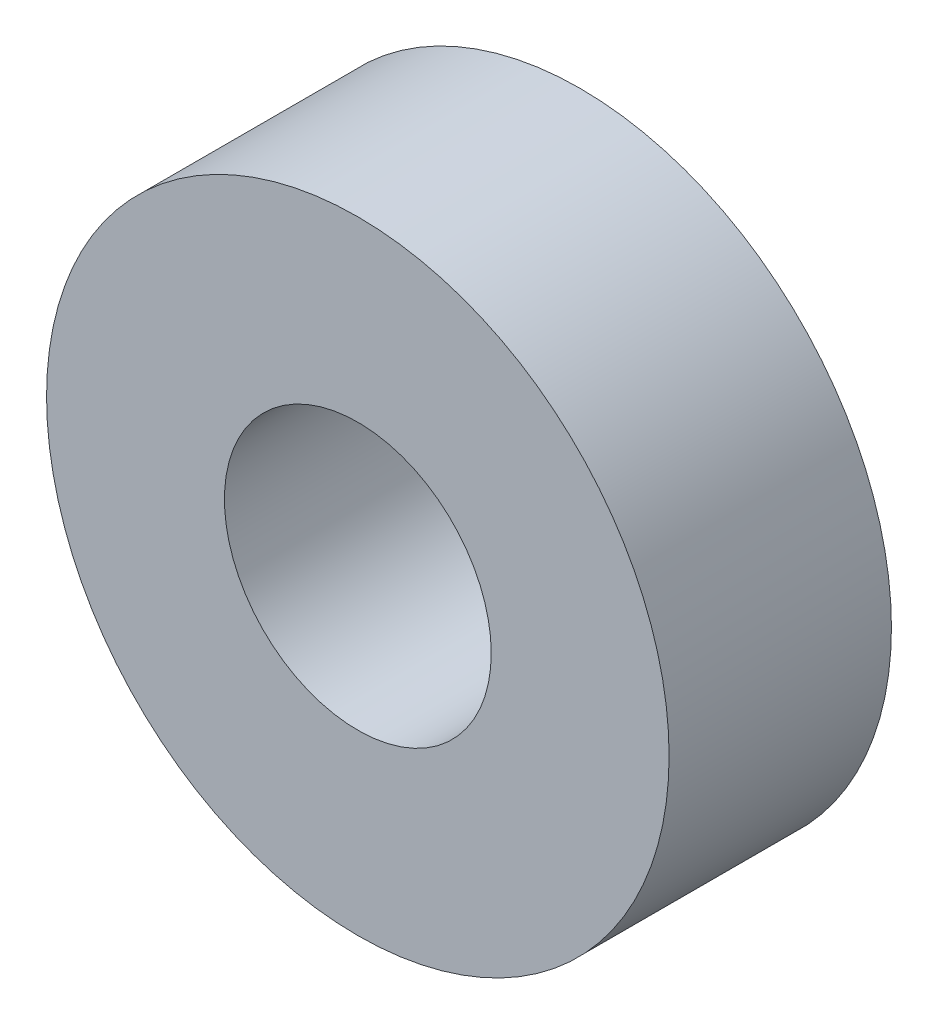
ISO-10303-21;
HEADER;
FILE_DESCRIPTION(('STEP AP214'),'2;1');
FILE_NAME('part.step','',(''),(''),'','','');
FILE_SCHEMA(('AUTOMOTIVE_DESIGN { 1 0 10303 214 1 1 1 1 }'));
ENDSEC;
DATA;
#1=APPLICATION_CONTEXT('core data for automotive mechanical design processes');
#2=APPLICATION_PROTOCOL_DEFINITION('international standard','automotive_design',2000,#1);
#3=PRODUCT_CONTEXT('',#1,'mechanical');
#4=PRODUCT('Part','Part','',(#3));
#5=PRODUCT_RELATED_PRODUCT_CATEGORY('part','',(#4));
#6=PRODUCT_DEFINITION_FORMATION('','',#4);
#7=PRODUCT_DEFINITION_CONTEXT('part definition',#1,'design');
#8=PRODUCT_DEFINITION('design','',#6,#7);
#9=PRODUCT_DEFINITION_SHAPE('','',#8);
#10=(LENGTH_UNIT() NAMED_UNIT(*) SI_UNIT(.MILLI.,.METRE.));
#11=(NAMED_UNIT(*) PLANE_ANGLE_UNIT() SI_UNIT($,.RADIAN.));
#12=(NAMED_UNIT(*) SI_UNIT($,.STERADIAN.) SOLID_ANGLE_UNIT());
#13=UNCERTAINTY_MEASURE_WITH_UNIT(LENGTH_MEASURE(1.E-05),#10,'distance_accuracy_value','');
#14=(GEOMETRIC_REPRESENTATION_CONTEXT(3) GLOBAL_UNCERTAINTY_ASSIGNED_CONTEXT((#13)) GLOBAL_UNIT_ASSIGNED_CONTEXT((#10,
#11,#12)) REPRESENTATION_CONTEXT('',''));
#15=CARTESIAN_POINT('',(0.,0.,0.));
#16=DIRECTION('',(0.,0.,1.));
#17=DIRECTION('',(1.,0.,0.));
#18=AXIS2_PLACEMENT_3D('',#15,#16,#17);
#19=CARTESIAN_POINT('',(0.,0.,2.5));
#20=DIRECTION('',(0.,0.,1.));
#21=DIRECTION('',(1.,0.,0.));
#22=AXIS2_PLACEMENT_3D('',#19,#20,#21);
#23=PLANE('',#22);
#24=CARTESIAN_POINT('',(0.,0.,2.5));
#25=DIRECTION('',(0.,0.,1.));
#26=DIRECTION('',(1.,0.,0.));
#27=AXIS2_PLACEMENT_3D('',#24,#25,#26);
#28=CIRCLE('',#27,7.);
#29=CARTESIAN_POINT('',(7.,0.,2.5));
#30=VERTEX_POINT('',#29);
#31=EDGE_CURVE('E10',#30,#30,#28,.T.);
#32=ORIENTED_EDGE('',*,*,#31,.T.);
#33=EDGE_LOOP('',(#32));
#34=FACE_BOUND('',#33,.T.);
#35=CARTESIAN_POINT('',(0.,0.,2.5));
#36=DIRECTION('',(0.,0.,1.));
#37=DIRECTION('',(1.,0.,0.));
#38=AXIS2_PLACEMENT_3D('',#35,#36,#37);
#39=CIRCLE('',#38,3.);
#40=CARTESIAN_POINT('',(3.,0.,2.5));
#41=VERTEX_POINT('',#40);
#42=EDGE_CURVE('E45',#41,#41,#39,.T.);
#43=ORIENTED_EDGE('',*,*,#42,.F.);
#44=EDGE_LOOP('',(#43));
#45=FACE_BOUND('',#44,.T.);
#46=ADVANCED_FACE('F34',(#34,#45),#23,.T.);
#47=CARTESIAN_POINT('',(0.,0.,-2.5));
#48=DIRECTION('',(0.,0.,1.));
#49=DIRECTION('',(1.,0.,0.));
#50=AXIS2_PLACEMENT_3D('',#47,#48,#49);
#51=PLANE('',#50);
#52=CARTESIAN_POINT('',(0.,0.,-2.5));
#53=DIRECTION('',(0.,0.,1.));
#54=DIRECTION('',(1.,0.,0.));
#55=AXIS2_PLACEMENT_3D('',#52,#53,#54);
#56=CIRCLE('',#55,7.);
#57=CARTESIAN_POINT('',(7.,0.,-2.5));
#58=VERTEX_POINT('',#57);
#59=EDGE_CURVE('E38',#58,#58,#56,.T.);
#60=ORIENTED_EDGE('',*,*,#59,.F.);
#61=EDGE_LOOP('',(#60));
#62=FACE_BOUND('',#61,.T.);
#63=CARTESIAN_POINT('',(0.,0.,-2.5));
#64=DIRECTION('',(0.,0.,1.));
#65=DIRECTION('',(1.,0.,0.));
#66=AXIS2_PLACEMENT_3D('',#63,#64,#65);
#67=CIRCLE('',#66,3.);
#68=CARTESIAN_POINT('',(3.,0.,-2.5));
#69=VERTEX_POINT('',#68);
#70=EDGE_CURVE('E47',#69,#69,#67,.T.);
#71=ORIENTED_EDGE('',*,*,#70,.T.);
#72=EDGE_LOOP('',(#71));
#73=FACE_BOUND('',#72,.T.);
#74=ADVANCED_FACE('F57',(#62,#73),#51,.F.);
#75=CARTESIAN_POINT('',(0.,0.,2.5));
#76=DIRECTION('',(0.,0.,-1.));
#77=DIRECTION('',(-1.,0.,0.));
#78=AXIS2_PLACEMENT_3D('',#75,#76,#77);
#79=CYLINDRICAL_SURFACE('',#78,7.);
#80=ORIENTED_EDGE('',*,*,#31,.F.);
#81=EDGE_LOOP('',(#80));
#82=FACE_BOUND('',#81,.T.);
#83=ORIENTED_EDGE('',*,*,#59,.T.);
#84=EDGE_LOOP('',(#83));
#85=FACE_BOUND('',#84,.T.);
#86=ADVANCED_FACE('F36',(#82,#85),#79,.T.);
#87=CARTESIAN_POINT('',(0.,0.,2.5));
#88=DIRECTION('',(0.,0.,-1.));
#89=DIRECTION('',(-1.,0.,0.));
#90=AXIS2_PLACEMENT_3D('',#87,#88,#89);
#91=CYLINDRICAL_SURFACE('',#90,3.);
#92=ORIENTED_EDGE('',*,*,#42,.T.);
#93=EDGE_LOOP('',(#92));
#94=FACE_BOUND('',#93,.T.);
#95=ORIENTED_EDGE('',*,*,#70,.F.);
#96=EDGE_LOOP('',(#95));
#97=FACE_BOUND('',#96,.T.);
#98=ADVANCED_FACE('F53',(#94,#97),#91,.F.);
#99=CLOSED_SHELL('',(#46,#74,#86,#98));
#100=MANIFOLD_SOLID_BREP('B2',#99);
#101=ADVANCED_BREP_SHAPE_REPRESENTATION('',(#18,#100),#14);
#102=SHAPE_DEFINITION_REPRESENTATION(#9,#101);
ENDSEC;
END-ISO-10303-21;
